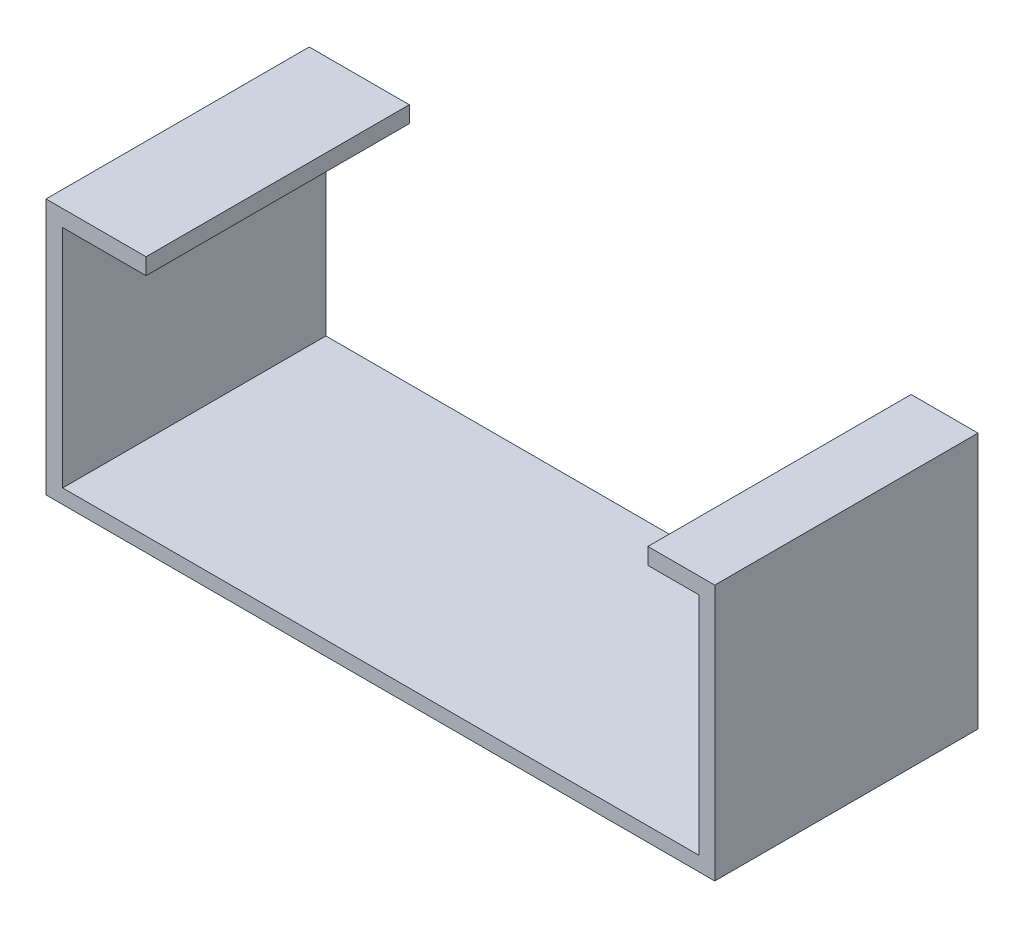
ISO-10303-21;
HEADER;
FILE_DESCRIPTION(('STEP AP214'),'2;1');
FILE_NAME('part.step','',(''),(''),'','','');
FILE_SCHEMA(('AUTOMOTIVE_DESIGN { 1 0 10303 214 1 1 1 1 }'));
ENDSEC;
DATA;
#1=APPLICATION_CONTEXT('core data for automotive mechanical design processes');
#2=APPLICATION_PROTOCOL_DEFINITION('international standard','automotive_design',2000,#1);
#3=PRODUCT_CONTEXT('',#1,'mechanical');
#4=PRODUCT('Part','Part','',(#3));
#5=PRODUCT_RELATED_PRODUCT_CATEGORY('part','',(#4));
#6=PRODUCT_DEFINITION_FORMATION('','',#4);
#7=PRODUCT_DEFINITION_CONTEXT('part definition',#1,'design');
#8=PRODUCT_DEFINITION('design','',#6,#7);
#9=PRODUCT_DEFINITION_SHAPE('','',#8);
#10=(LENGTH_UNIT() NAMED_UNIT(*) SI_UNIT(.MILLI.,.METRE.));
#11=(NAMED_UNIT(*) PLANE_ANGLE_UNIT() SI_UNIT($,.RADIAN.));
#12=(NAMED_UNIT(*) SI_UNIT($,.STERADIAN.) SOLID_ANGLE_UNIT());
#13=UNCERTAINTY_MEASURE_WITH_UNIT(LENGTH_MEASURE(1.E-05),#10,'distance_accuracy_value','');
#14=(GEOMETRIC_REPRESENTATION_CONTEXT(3) GLOBAL_UNCERTAINTY_ASSIGNED_CONTEXT((#13)) GLOBAL_UNIT_ASSIGNED_CONTEXT((#10,
#11,#12)) REPRESENTATION_CONTEXT('',''));
#15=CARTESIAN_POINT('',(0.,0.,0.));
#16=DIRECTION('',(0.,0.,1.));
#17=DIRECTION('',(1.,0.,0.));
#18=AXIS2_PLACEMENT_3D('',#15,#16,#17);
#19=CARTESIAN_POINT('',(-7.62115062,-2.921,6.0000007));
#20=DIRECTION('',(0.,0.,1.));
#21=DIRECTION('',(1.,0.,0.));
#22=AXIS2_PLACEMENT_3D('',#19,#20,#21);
#23=PLANE('',#22);
#24=DIRECTION('',(-1.,0.,0.));
#25=VECTOR('',#24,1.);
#26=CARTESIAN_POINT('',(7.62115062,-2.921,6.0000007));
#27=LINE('',#26,#25);
#28=CARTESIAN_POINT('',(7.62115062,-2.921,6.0000007));
#29=VERTEX_POINT('',#28);
#30=CARTESIAN_POINT('',(-7.62115062,-2.921,6.0000007));
#31=VERTEX_POINT('',#30);
#32=EDGE_CURVE('E27',#29,#31,#27,.T.);
#33=ORIENTED_EDGE('',*,*,#32,.F.);
#34=DIRECTION('',(0.,-1.,0.));
#35=VECTOR('',#34,1.);
#36=CARTESIAN_POINT('',(7.62115062,2.921,6.0000007));
#37=LINE('',#36,#35);
#38=CARTESIAN_POINT('',(7.62115062,2.921,6.0000007));
#39=VERTEX_POINT('',#38);
#40=EDGE_CURVE('E139',#39,#29,#37,.T.);
#41=ORIENTED_EDGE('',*,*,#40,.F.);
#42=DIRECTION('',(1.,0.,0.));
#43=VECTOR('',#42,1.);
#44=CARTESIAN_POINT('',(6.09715062,2.921,6.0000007));
#45=LINE('',#44,#43);
#46=CARTESIAN_POINT('',(6.09715062,2.921,6.0000007));
#47=VERTEX_POINT('',#46);
#48=EDGE_CURVE('E183',#47,#39,#45,.T.);
#49=ORIENTED_EDGE('',*,*,#48,.F.);
#50=DIRECTION('',(0.,1.,0.));
#51=VECTOR('',#50,1.);
#52=CARTESIAN_POINT('',(6.09715062,2.54700024,6.0000007));
#53=LINE('',#52,#51);
#54=CARTESIAN_POINT('',(6.09715062,2.54700024,6.0000007));
#55=VERTEX_POINT('',#54);
#56=EDGE_CURVE('E173',#55,#47,#53,.T.);
#57=ORIENTED_EDGE('',*,*,#56,.F.);
#58=DIRECTION('',(-1.,0.,0.));
#59=VECTOR('',#58,1.);
#60=CARTESIAN_POINT('',(7.26115134,2.54700024,6.0000007));
#61=LINE('',#60,#59);
#62=CARTESIAN_POINT('',(7.26115134,2.54700024,6.0000007));
#63=VERTEX_POINT('',#62);
#64=EDGE_CURVE('E134',#63,#55,#61,.T.);
#65=ORIENTED_EDGE('',*,*,#64,.F.);
#66=DIRECTION('',(0.,1.,0.));
#67=VECTOR('',#66,1.);
#68=CARTESIAN_POINT('',(7.26115134,-2.59299964,6.0000007));
#69=LINE('',#68,#67);
#70=CARTESIAN_POINT('',(7.26115134,-2.59299964,6.0000007));
#71=VERTEX_POINT('',#70);
#72=EDGE_CURVE('E123',#71,#63,#69,.T.);
#73=ORIENTED_EDGE('',*,*,#72,.F.);
#74=DIRECTION('',(1.,0.,0.));
#75=VECTOR('',#74,1.);
#76=CARTESIAN_POINT('',(-7.24115138,-2.59299964,6.0000007));
#77=LINE('',#76,#75);
#78=CARTESIAN_POINT('',(-7.24115138,-2.59299964,6.0000007));
#79=VERTEX_POINT('',#78);
#80=EDGE_CURVE('E143',#79,#71,#77,.T.);
#81=ORIENTED_EDGE('',*,*,#80,.F.);
#82=DIRECTION('',(0.,-1.,0.));
#83=VECTOR('',#82,1.);
#84=CARTESIAN_POINT('',(-7.24115138,2.54700024,6.0000007));
#85=LINE('',#84,#83);
#86=CARTESIAN_POINT('',(-7.24115138,2.54700024,6.0000007));
#87=VERTEX_POINT('',#86);
#88=EDGE_CURVE('E160',#87,#79,#85,.T.);
#89=ORIENTED_EDGE('',*,*,#88,.F.);
#90=DIRECTION('',(-1.,0.,0.));
#91=VECTOR('',#90,1.);
#92=CARTESIAN_POINT('',(-5.3411501,2.54700024,6.0000007));
#93=LINE('',#92,#91);
#94=CARTESIAN_POINT('',(-5.3411501,2.54700024,6.0000007));
#95=VERTEX_POINT('',#94);
#96=EDGE_CURVE('E91',#95,#87,#93,.T.);
#97=ORIENTED_EDGE('',*,*,#96,.F.);
#98=DIRECTION('',(0.,-1.,0.));
#99=VECTOR('',#98,1.);
#100=CARTESIAN_POINT('',(-5.3411501,2.921,6.0000007));
#101=LINE('',#100,#99);
#102=CARTESIAN_POINT('',(-5.3411501,2.921,6.0000007));
#103=VERTEX_POINT('',#102);
#104=EDGE_CURVE('E103',#103,#95,#101,.T.);
#105=ORIENTED_EDGE('',*,*,#104,.F.);
#106=DIRECTION('',(1.,0.,0.));
#107=VECTOR('',#106,1.);
#108=CARTESIAN_POINT('',(-7.62115062,2.921,6.0000007));
#109=LINE('',#108,#107);
#110=CARTESIAN_POINT('',(-7.62115062,2.921,6.0000007));
#111=VERTEX_POINT('',#110);
#112=EDGE_CURVE('E107',#111,#103,#109,.T.);
#113=ORIENTED_EDGE('',*,*,#112,.F.);
#114=DIRECTION('',(0.,1.,0.));
#115=VECTOR('',#114,1.);
#116=CARTESIAN_POINT('',(-7.62115062,-2.921,6.0000007));
#117=LINE('',#116,#115);
#118=EDGE_CURVE('E162',#31,#111,#117,.T.);
#119=ORIENTED_EDGE('',*,*,#118,.F.);
#120=EDGE_LOOP('',(#33,#41,#49,#57,#65,#73,#81,#89,#97,#105,#113,#119));
#121=FACE_BOUND('',#120,.T.);
#122=ADVANCED_FACE('F16',(#121),#23,.T.);
#123=CARTESIAN_POINT('',(-7.62115062,-2.921,0.));
#124=DIRECTION('',(0.,0.,1.));
#125=DIRECTION('',(1.,0.,0.));
#126=AXIS2_PLACEMENT_3D('',#123,#124,#125);
#127=PLANE('',#126);
#128=DIRECTION('',(0.,1.,0.));
#129=VECTOR('',#128,1.);
#130=CARTESIAN_POINT('',(-7.62115062,-2.921,0.));
#131=LINE('',#130,#129);
#132=CARTESIAN_POINT('',(-7.62115062,-2.921,0.));
#133=VERTEX_POINT('',#132);
#134=CARTESIAN_POINT('',(-7.62115062,2.921,0.));
#135=VERTEX_POINT('',#134);
#136=EDGE_CURVE('E98',#133,#135,#131,.T.);
#137=ORIENTED_EDGE('',*,*,#136,.T.);
#138=DIRECTION('',(1.,0.,0.));
#139=VECTOR('',#138,1.);
#140=CARTESIAN_POINT('',(-7.62115062,2.921,0.));
#141=LINE('',#140,#139);
#142=CARTESIAN_POINT('',(-5.3411501,2.921,0.));
#143=VERTEX_POINT('',#142);
#144=EDGE_CURVE('E95',#135,#143,#141,.T.);
#145=ORIENTED_EDGE('',*,*,#144,.T.);
#146=DIRECTION('',(0.,-1.,0.));
#147=VECTOR('',#146,1.);
#148=CARTESIAN_POINT('',(-5.3411501,2.921,0.));
#149=LINE('',#148,#147);
#150=CARTESIAN_POINT('',(-5.3411501,2.54700024,0.));
#151=VERTEX_POINT('',#150);
#152=EDGE_CURVE('E79',#143,#151,#149,.T.);
#153=ORIENTED_EDGE('',*,*,#152,.T.);
#154=DIRECTION('',(-1.,0.,0.));
#155=VECTOR('',#154,1.);
#156=CARTESIAN_POINT('',(-5.3411501,2.54700024,0.));
#157=LINE('',#156,#155);
#158=CARTESIAN_POINT('',(-7.24115138,2.54700024,0.));
#159=VERTEX_POINT('',#158);
#160=EDGE_CURVE('E129',#151,#159,#157,.T.);
#161=ORIENTED_EDGE('',*,*,#160,.T.);
#162=DIRECTION('',(0.,-1.,0.));
#163=VECTOR('',#162,1.);
#164=CARTESIAN_POINT('',(-7.24115138,2.54700024,0.));
#165=LINE('',#164,#163);
#166=CARTESIAN_POINT('',(-7.24115138,-2.59299964,0.));
#167=VERTEX_POINT('',#166);
#168=EDGE_CURVE('E147',#159,#167,#165,.T.);
#169=ORIENTED_EDGE('',*,*,#168,.T.);
#170=DIRECTION('',(1.,0.,0.));
#171=VECTOR('',#170,1.);
#172=CARTESIAN_POINT('',(-7.24115138,-2.59299964,0.));
#173=LINE('',#172,#171);
#174=CARTESIAN_POINT('',(7.26115134,-2.59299964,0.));
#175=VERTEX_POINT('',#174);
#176=EDGE_CURVE('E119',#167,#175,#173,.T.);
#177=ORIENTED_EDGE('',*,*,#176,.T.);
#178=DIRECTION('',(0.,1.,0.));
#179=VECTOR('',#178,1.);
#180=CARTESIAN_POINT('',(7.26115134,-2.59299964,0.));
#181=LINE('',#180,#179);
#182=CARTESIAN_POINT('',(7.26115134,2.54700024,0.));
#183=VERTEX_POINT('',#182);
#184=EDGE_CURVE('E130',#175,#183,#181,.T.);
#185=ORIENTED_EDGE('',*,*,#184,.T.);
#186=DIRECTION('',(-1.,0.,0.));
#187=VECTOR('',#186,1.);
#188=CARTESIAN_POINT('',(7.26115134,2.54700024,0.));
#189=LINE('',#188,#187);
#190=CARTESIAN_POINT('',(6.09715062,2.54700024,0.));
#191=VERTEX_POINT('',#190);
#192=EDGE_CURVE('E178',#183,#191,#189,.T.);
#193=ORIENTED_EDGE('',*,*,#192,.T.);
#194=DIRECTION('',(0.,1.,0.));
#195=VECTOR('',#194,1.);
#196=CARTESIAN_POINT('',(6.09715062,2.54700024,0.));
#197=LINE('',#196,#195);
#198=CARTESIAN_POINT('',(6.09715062,2.921,0.));
#199=VERTEX_POINT('',#198);
#200=EDGE_CURVE('E179',#191,#199,#197,.T.);
#201=ORIENTED_EDGE('',*,*,#200,.T.);
#202=DIRECTION('',(1.,0.,0.));
#203=VECTOR('',#202,1.);
#204=CARTESIAN_POINT('',(6.09715062,2.921,0.));
#205=LINE('',#204,#203);
#206=CARTESIAN_POINT('',(7.62115062,2.921,0.));
#207=VERTEX_POINT('',#206);
#208=EDGE_CURVE('E117',#199,#207,#205,.T.);
#209=ORIENTED_EDGE('',*,*,#208,.T.);
#210=DIRECTION('',(0.,-1.,0.));
#211=VECTOR('',#210,1.);
#212=CARTESIAN_POINT('',(7.62115062,2.921,0.));
#213=LINE('',#212,#211);
#214=CARTESIAN_POINT('',(7.62115062,-2.921,0.));
#215=VERTEX_POINT('',#214);
#216=EDGE_CURVE('E136',#207,#215,#213,.T.);
#217=ORIENTED_EDGE('',*,*,#216,.T.);
#218=DIRECTION('',(-1.,0.,0.));
#219=VECTOR('',#218,1.);
#220=CARTESIAN_POINT('',(7.62115062,-2.921,0.));
#221=LINE('',#220,#219);
#222=EDGE_CURVE('E11',#215,#133,#221,.T.);
#223=ORIENTED_EDGE('',*,*,#222,.T.);
#224=EDGE_LOOP('',(#137,#145,#153,#161,#169,#177,#185,#193,#201,#209,#217,#223));
#225=FACE_BOUND('',#224,.T.);
#226=ADVANCED_FACE('F96',(#225),#127,.F.);
#227=CARTESIAN_POINT('',(7.62115062,-2.921,0.));
#228=DIRECTION('',(0.,-1.,0.));
#229=DIRECTION('',(0.,0.,-1.));
#230=AXIS2_PLACEMENT_3D('',#227,#228,#229);
#231=PLANE('',#230);
#232=DIRECTION('',(0.,0.,1.));
#233=VECTOR('',#232,1.);
#234=CARTESIAN_POINT('',(7.62115062,-2.921,0.));
#235=LINE('',#234,#233);
#236=EDGE_CURVE('E20',#215,#29,#235,.T.);
#237=ORIENTED_EDGE('',*,*,#236,.T.);
#238=ORIENTED_EDGE('',*,*,#32,.T.);
#239=DIRECTION('',(0.,0.,1.));
#240=VECTOR('',#239,1.);
#241=CARTESIAN_POINT('',(-7.62115062,-2.921,0.));
#242=LINE('',#241,#240);
#243=EDGE_CURVE('E169',#133,#31,#242,.T.);
#244=ORIENTED_EDGE('',*,*,#243,.F.);
#245=ORIENTED_EDGE('',*,*,#222,.F.);
#246=EDGE_LOOP('',(#237,#238,#244,#245));
#247=FACE_BOUND('',#246,.T.);
#248=ADVANCED_FACE('F221',(#247),#231,.T.);
#249=CARTESIAN_POINT('',(7.62115062,2.921,0.));
#250=DIRECTION('',(1.,0.,0.));
#251=DIRECTION('',(0.,1.,0.));
#252=AXIS2_PLACEMENT_3D('',#249,#250,#251);
#253=PLANE('',#252);
#254=DIRECTION('',(0.,0.,1.));
#255=VECTOR('',#254,1.);
#256=CARTESIAN_POINT('',(7.62115062,2.921,0.));
#257=LINE('',#256,#255);
#258=EDGE_CURVE('E187',#207,#39,#257,.T.);
#259=ORIENTED_EDGE('',*,*,#258,.T.);
#260=ORIENTED_EDGE('',*,*,#40,.T.);
#261=ORIENTED_EDGE('',*,*,#236,.F.);
#262=ORIENTED_EDGE('',*,*,#216,.F.);
#263=EDGE_LOOP('',(#259,#260,#261,#262));
#264=FACE_BOUND('',#263,.T.);
#265=ADVANCED_FACE('F274',(#264),#253,.T.);
#266=CARTESIAN_POINT('',(6.09715062,2.921,0.));
#267=DIRECTION('',(0.,1.,0.));
#268=DIRECTION('',(1.,0.,0.));
#269=AXIS2_PLACEMENT_3D('',#266,#267,#268);
#270=PLANE('',#269);
#271=DIRECTION('',(0.,0.,1.));
#272=VECTOR('',#271,1.);
#273=CARTESIAN_POINT('',(6.09715062,2.921,0.));
#274=LINE('',#273,#272);
#275=EDGE_CURVE('E177',#199,#47,#274,.T.);
#276=ORIENTED_EDGE('',*,*,#275,.T.);
#277=ORIENTED_EDGE('',*,*,#48,.T.);
#278=ORIENTED_EDGE('',*,*,#258,.F.);
#279=ORIENTED_EDGE('',*,*,#208,.F.);
#280=EDGE_LOOP('',(#276,#277,#278,#279));
#281=FACE_BOUND('',#280,.T.);
#282=ADVANCED_FACE('F277',(#281),#270,.T.);
#283=CARTESIAN_POINT('',(6.09715062,2.54700024,0.));
#284=DIRECTION('',(-1.,0.,0.));
#285=DIRECTION('',(0.,0.,1.));
#286=AXIS2_PLACEMENT_3D('',#283,#284,#285);
#287=PLANE('',#286);
#288=DIRECTION('',(0.,0.,1.));
#289=VECTOR('',#288,1.);
#290=CARTESIAN_POINT('',(6.09715062,2.54700024,0.));
#291=LINE('',#290,#289);
#292=EDGE_CURVE('E212',#191,#55,#291,.T.);
#293=ORIENTED_EDGE('',*,*,#292,.T.);
#294=ORIENTED_EDGE('',*,*,#56,.T.);
#295=ORIENTED_EDGE('',*,*,#275,.F.);
#296=ORIENTED_EDGE('',*,*,#200,.F.);
#297=EDGE_LOOP('',(#293,#294,#295,#296));
#298=FACE_BOUND('',#297,.T.);
#299=ADVANCED_FACE('F282',(#298),#287,.T.);
#300=CARTESIAN_POINT('',(7.26115134,2.54700024,0.));
#301=DIRECTION('',(0.,-1.,0.));
#302=DIRECTION('',(0.,0.,-1.));
#303=AXIS2_PLACEMENT_3D('',#300,#301,#302);
#304=PLANE('',#303);
#305=DIRECTION('',(0.,0.,1.));
#306=VECTOR('',#305,1.);
#307=CARTESIAN_POINT('',(7.26115134,2.54700024,0.));
#308=LINE('',#307,#306);
#309=EDGE_CURVE('E135',#183,#63,#308,.T.);
#310=ORIENTED_EDGE('',*,*,#309,.T.);
#311=ORIENTED_EDGE('',*,*,#64,.T.);
#312=ORIENTED_EDGE('',*,*,#292,.F.);
#313=ORIENTED_EDGE('',*,*,#192,.F.);
#314=EDGE_LOOP('',(#310,#311,#312,#313));
#315=FACE_BOUND('',#314,.T.);
#316=ADVANCED_FACE('F292',(#315),#304,.T.);
#317=CARTESIAN_POINT('',(7.26115134,-2.59299964,0.));
#318=DIRECTION('',(-1.,0.,0.));
#319=DIRECTION('',(0.,0.,1.));
#320=AXIS2_PLACEMENT_3D('',#317,#318,#319);
#321=PLANE('',#320);
#322=DIRECTION('',(0.,0.,1.));
#323=VECTOR('',#322,1.);
#324=CARTESIAN_POINT('',(7.26115134,-2.59299964,0.));
#325=LINE('',#324,#323);
#326=EDGE_CURVE('E124',#175,#71,#325,.T.);
#327=ORIENTED_EDGE('',*,*,#326,.T.);
#328=ORIENTED_EDGE('',*,*,#72,.T.);
#329=ORIENTED_EDGE('',*,*,#309,.F.);
#330=ORIENTED_EDGE('',*,*,#184,.F.);
#331=EDGE_LOOP('',(#327,#328,#329,#330));
#332=FACE_BOUND('',#331,.T.);
#333=ADVANCED_FACE('F18',(#332),#321,.T.);
#334=CARTESIAN_POINT('',(-7.24115138,-2.59299964,0.));
#335=DIRECTION('',(0.,1.,0.));
#336=DIRECTION('',(1.,0.,0.));
#337=AXIS2_PLACEMENT_3D('',#334,#335,#336);
#338=PLANE('',#337);
#339=DIRECTION('',(0.,0.,1.));
#340=VECTOR('',#339,1.);
#341=CARTESIAN_POINT('',(-7.24115138,-2.59299964,0.));
#342=LINE('',#341,#340);
#343=EDGE_CURVE('E154',#167,#79,#342,.T.);
#344=ORIENTED_EDGE('',*,*,#343,.T.);
#345=ORIENTED_EDGE('',*,*,#80,.T.);
#346=ORIENTED_EDGE('',*,*,#326,.F.);
#347=ORIENTED_EDGE('',*,*,#176,.F.);
#348=EDGE_LOOP('',(#344,#345,#346,#347));
#349=FACE_BOUND('',#348,.T.);
#350=ADVANCED_FACE('F298',(#349),#338,.T.);
#351=CARTESIAN_POINT('',(-7.24115138,2.54700024,0.));
#352=DIRECTION('',(1.,0.,0.));
#353=DIRECTION('',(0.,1.,0.));
#354=AXIS2_PLACEMENT_3D('',#351,#352,#353);
#355=PLANE('',#354);
#356=DIRECTION('',(0.,0.,1.));
#357=VECTOR('',#356,1.);
#358=CARTESIAN_POINT('',(-7.24115138,2.54700024,0.));
#359=LINE('',#358,#357);
#360=EDGE_CURVE('E125',#159,#87,#359,.T.);
#361=ORIENTED_EDGE('',*,*,#360,.T.);
#362=ORIENTED_EDGE('',*,*,#88,.T.);
#363=ORIENTED_EDGE('',*,*,#343,.F.);
#364=ORIENTED_EDGE('',*,*,#168,.F.);
#365=EDGE_LOOP('',(#361,#362,#363,#364));
#366=FACE_BOUND('',#365,.T.);
#367=ADVANCED_FACE('F313',(#366),#355,.T.);
#368=CARTESIAN_POINT('',(-5.3411501,2.54700024,0.));
#369=DIRECTION('',(0.,-1.,0.));
#370=DIRECTION('',(0.,0.,-1.));
#371=AXIS2_PLACEMENT_3D('',#368,#369,#370);
#372=PLANE('',#371);
#373=DIRECTION('',(0.,0.,1.));
#374=VECTOR('',#373,1.);
#375=CARTESIAN_POINT('',(-5.3411501,2.54700024,0.));
#376=LINE('',#375,#374);
#377=EDGE_CURVE('E87',#151,#95,#376,.T.);
#378=ORIENTED_EDGE('',*,*,#377,.T.);
#379=ORIENTED_EDGE('',*,*,#96,.T.);
#380=ORIENTED_EDGE('',*,*,#360,.F.);
#381=ORIENTED_EDGE('',*,*,#160,.F.);
#382=EDGE_LOOP('',(#378,#379,#380,#381));
#383=FACE_BOUND('',#382,.T.);
#384=ADVANCED_FACE('F315',(#383),#372,.T.);
#385=CARTESIAN_POINT('',(-5.3411501,2.921,0.));
#386=DIRECTION('',(1.,0.,0.));
#387=DIRECTION('',(0.,1.,0.));
#388=AXIS2_PLACEMENT_3D('',#385,#386,#387);
#389=PLANE('',#388);
#390=DIRECTION('',(0.,0.,1.));
#391=VECTOR('',#390,1.);
#392=CARTESIAN_POINT('',(-5.3411501,2.921,0.));
#393=LINE('',#392,#391);
#394=EDGE_CURVE('E84',#143,#103,#393,.T.);
#395=ORIENTED_EDGE('',*,*,#394,.T.);
#396=ORIENTED_EDGE('',*,*,#104,.T.);
#397=ORIENTED_EDGE('',*,*,#377,.F.);
#398=ORIENTED_EDGE('',*,*,#152,.F.);
#399=EDGE_LOOP('',(#395,#396,#397,#398));
#400=FACE_BOUND('',#399,.T.);
#401=ADVANCED_FACE('F81',(#400),#389,.T.);
#402=CARTESIAN_POINT('',(-7.62115062,2.921,0.));
#403=DIRECTION('',(0.,1.,0.));
#404=DIRECTION('',(1.,0.,0.));
#405=AXIS2_PLACEMENT_3D('',#402,#403,#404);
#406=PLANE('',#405);
#407=DIRECTION('',(0.,0.,1.));
#408=VECTOR('',#407,1.);
#409=CARTESIAN_POINT('',(-7.62115062,2.921,0.));
#410=LINE('',#409,#408);
#411=EDGE_CURVE('E150',#135,#111,#410,.T.);
#412=ORIENTED_EDGE('',*,*,#411,.T.);
#413=ORIENTED_EDGE('',*,*,#112,.T.);
#414=ORIENTED_EDGE('',*,*,#394,.F.);
#415=ORIENTED_EDGE('',*,*,#144,.F.);
#416=EDGE_LOOP('',(#412,#413,#414,#415));
#417=FACE_BOUND('',#416,.T.);
#418=ADVANCED_FACE('F105',(#417),#406,.T.);
#419=CARTESIAN_POINT('',(-7.62115062,-2.921,0.));
#420=DIRECTION('',(-1.,0.,0.));
#421=DIRECTION('',(0.,0.,1.));
#422=AXIS2_PLACEMENT_3D('',#419,#420,#421);
#423=PLANE('',#422);
#424=ORIENTED_EDGE('',*,*,#243,.T.);
#425=ORIENTED_EDGE('',*,*,#118,.T.);
#426=ORIENTED_EDGE('',*,*,#411,.F.);
#427=ORIENTED_EDGE('',*,*,#136,.F.);
#428=EDGE_LOOP('',(#424,#425,#426,#427));
#429=FACE_BOUND('',#428,.T.);
#430=ADVANCED_FACE('F232',(#429),#423,.T.);
#431=CLOSED_SHELL('',(#122,#226,#248,#265,#282,#299,#316,#333,#350,#367,#384,#401,#418,#430));
#432=MANIFOLD_SOLID_BREP('B1',#431);
#433=ADVANCED_BREP_SHAPE_REPRESENTATION('',(#18,#432),#14);
#434=SHAPE_DEFINITION_REPRESENTATION(#9,#433);
ENDSEC;
END-ISO-10303-21;
